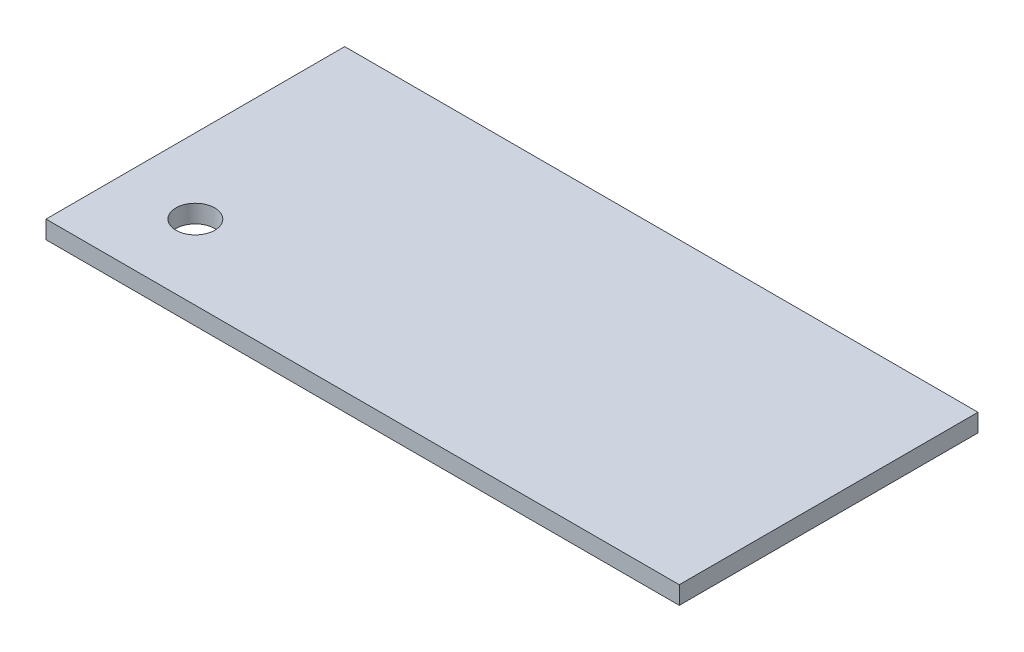
ISO-10303-21;
HEADER;
FILE_DESCRIPTION(('STEP AP214'),'2;1');
FILE_NAME('part.step','',(''),(''),'','','');
FILE_SCHEMA(('AUTOMOTIVE_DESIGN { 1 0 10303 214 1 1 1 1 }'));
ENDSEC;
DATA;
#1=APPLICATION_CONTEXT('core data for automotive mechanical design processes');
#2=APPLICATION_PROTOCOL_DEFINITION('international standard','automotive_design',2000,#1);
#3=PRODUCT_CONTEXT('',#1,'mechanical');
#4=PRODUCT('Part','Part','',(#3));
#5=PRODUCT_RELATED_PRODUCT_CATEGORY('part','',(#4));
#6=PRODUCT_DEFINITION_FORMATION('','',#4);
#7=PRODUCT_DEFINITION_CONTEXT('part definition',#1,'design');
#8=PRODUCT_DEFINITION('design','',#6,#7);
#9=PRODUCT_DEFINITION_SHAPE('','',#8);
#10=(LENGTH_UNIT() NAMED_UNIT(*) SI_UNIT(.MILLI.,.METRE.));
#11=(NAMED_UNIT(*) PLANE_ANGLE_UNIT() SI_UNIT($,.RADIAN.));
#12=(NAMED_UNIT(*) SI_UNIT($,.STERADIAN.) SOLID_ANGLE_UNIT());
#13=UNCERTAINTY_MEASURE_WITH_UNIT(LENGTH_MEASURE(1.E-05),#10,'distance_accuracy_value','');
#14=(GEOMETRIC_REPRESENTATION_CONTEXT(3) GLOBAL_UNCERTAINTY_ASSIGNED_CONTEXT((#13)) GLOBAL_UNIT_ASSIGNED_CONTEXT((#10,
#11,#12)) REPRESENTATION_CONTEXT('',''));
#15=CARTESIAN_POINT('',(0.,0.,0.));
#16=DIRECTION('',(0.,0.,1.));
#17=DIRECTION('',(1.,0.,0.));
#18=AXIS2_PLACEMENT_3D('',#15,#16,#17);
#19=CARTESIAN_POINT('',(0.,6.,0.));
#20=DIRECTION('',(1.,0.,0.));
#21=DIRECTION('',(0.,0.,-1.));
#22=AXIS2_PLACEMENT_3D('',#19,#20,#21);
#23=PLANE('',#22);
#24=DIRECTION('',(0.,0.,1.));
#25=VECTOR('',#24,1.);
#26=CARTESIAN_POINT('',(0.,0.,0.));
#27=LINE('',#26,#25);
#28=CARTESIAN_POINT('',(0.,0.,-100.));
#29=VERTEX_POINT('',#28);
#30=CARTESIAN_POINT('',(0.,0.,0.));
#31=VERTEX_POINT('',#30);
#32=EDGE_CURVE('E96',#29,#31,#27,.T.);
#33=ORIENTED_EDGE('',*,*,#32,.T.);
#34=DIRECTION('',(0.,-1.,0.));
#35=VECTOR('',#34,1.);
#36=CARTESIAN_POINT('',(0.,6.,0.));
#37=LINE('',#36,#35);
#38=CARTESIAN_POINT('',(0.,6.,0.));
#39=VERTEX_POINT('',#38);
#40=EDGE_CURVE('E11',#39,#31,#37,.T.);
#41=ORIENTED_EDGE('',*,*,#40,.F.);
#42=DIRECTION('',(0.,0.,1.));
#43=VECTOR('',#42,1.);
#44=CARTESIAN_POINT('',(0.,6.,0.));
#45=LINE('',#44,#43);
#46=CARTESIAN_POINT('',(0.,6.,-100.));
#47=VERTEX_POINT('',#46);
#48=EDGE_CURVE('E84',#47,#39,#45,.T.);
#49=ORIENTED_EDGE('',*,*,#48,.F.);
#50=DIRECTION('',(0.,-1.,0.));
#51=VECTOR('',#50,1.);
#52=CARTESIAN_POINT('',(0.,6.,-100.));
#53=LINE('',#52,#51);
#54=EDGE_CURVE('E92',#47,#29,#53,.T.);
#55=ORIENTED_EDGE('',*,*,#54,.T.);
#56=EDGE_LOOP('',(#33,#41,#49,#55));
#57=FACE_BOUND('',#56,.T.);
#58=ADVANCED_FACE('F33',(#57),#23,.F.);
#59=CARTESIAN_POINT('',(0.,6.,0.));
#60=DIRECTION('',(0.,0.,-1.));
#61=DIRECTION('',(-1.,0.,0.));
#62=AXIS2_PLACEMENT_3D('',#59,#60,#61);
#63=PLANE('',#62);
#64=DIRECTION('',(1.,0.,0.));
#65=VECTOR('',#64,1.);
#66=CARTESIAN_POINT('',(0.,0.,0.));
#67=LINE('',#66,#65);
#68=CARTESIAN_POINT('',(212.,0.,0.));
#69=VERTEX_POINT('',#68);
#70=EDGE_CURVE('E88',#31,#69,#67,.T.);
#71=ORIENTED_EDGE('',*,*,#70,.T.);
#72=DIRECTION('',(0.,-1.,0.));
#73=VECTOR('',#72,1.);
#74=CARTESIAN_POINT('',(212.,6.,0.));
#75=LINE('',#74,#73);
#76=CARTESIAN_POINT('',(212.,6.,0.));
#77=VERTEX_POINT('',#76);
#78=EDGE_CURVE('E41',#77,#69,#75,.T.);
#79=ORIENTED_EDGE('',*,*,#78,.F.);
#80=DIRECTION('',(1.,0.,0.));
#81=VECTOR('',#80,1.);
#82=CARTESIAN_POINT('',(0.,6.,0.));
#83=LINE('',#82,#81);
#84=EDGE_CURVE('E79',#39,#77,#83,.T.);
#85=ORIENTED_EDGE('',*,*,#84,.F.);
#86=ORIENTED_EDGE('',*,*,#40,.T.);
#87=EDGE_LOOP('',(#71,#79,#85,#86));
#88=FACE_BOUND('',#87,.T.);
#89=ADVANCED_FACE('F87',(#88),#63,.F.);
#90=CARTESIAN_POINT('',(212.,6.,0.));
#91=DIRECTION('',(-1.,0.,0.));
#92=DIRECTION('',(0.,0.,1.));
#93=AXIS2_PLACEMENT_3D('',#90,#91,#92);
#94=PLANE('',#93);
#95=DIRECTION('',(0.,0.,-1.));
#96=VECTOR('',#95,1.);
#97=CARTESIAN_POINT('',(212.,0.,0.));
#98=LINE('',#97,#96);
#99=CARTESIAN_POINT('',(212.,0.,-100.));
#100=VERTEX_POINT('',#99);
#101=EDGE_CURVE('E66',#69,#100,#98,.T.);
#102=ORIENTED_EDGE('',*,*,#101,.T.);
#103=DIRECTION('',(0.,-1.,0.));
#104=VECTOR('',#103,1.);
#105=CARTESIAN_POINT('',(212.,6.,-100.));
#106=LINE('',#105,#104);
#107=CARTESIAN_POINT('',(212.,6.,-100.));
#108=VERTEX_POINT('',#107);
#109=EDGE_CURVE('E89',#108,#100,#106,.T.);
#110=ORIENTED_EDGE('',*,*,#109,.F.);
#111=DIRECTION('',(0.,0.,-1.));
#112=VECTOR('',#111,1.);
#113=CARTESIAN_POINT('',(212.,6.,0.));
#114=LINE('',#113,#112);
#115=EDGE_CURVE('E82',#77,#108,#114,.T.);
#116=ORIENTED_EDGE('',*,*,#115,.F.);
#117=ORIENTED_EDGE('',*,*,#78,.T.);
#118=EDGE_LOOP('',(#102,#110,#116,#117));
#119=FACE_BOUND('',#118,.T.);
#120=ADVANCED_FACE('F90',(#119),#94,.F.);
#121=CARTESIAN_POINT('',(0.,6.,-100.));
#122=DIRECTION('',(0.,0.,1.));
#123=DIRECTION('',(1.,0.,0.));
#124=AXIS2_PLACEMENT_3D('',#121,#122,#123);
#125=PLANE('',#124);
#126=DIRECTION('',(-1.,0.,0.));
#127=VECTOR('',#126,1.);
#128=CARTESIAN_POINT('',(0.,0.,-100.));
#129=LINE('',#128,#127);
#130=EDGE_CURVE('E72',#100,#29,#129,.T.);
#131=ORIENTED_EDGE('',*,*,#130,.T.);
#132=ORIENTED_EDGE('',*,*,#54,.F.);
#133=DIRECTION('',(-1.,0.,0.));
#134=VECTOR('',#133,1.);
#135=CARTESIAN_POINT('',(0.,6.,-100.));
#136=LINE('',#135,#134);
#137=EDGE_CURVE('E49',#108,#47,#136,.T.);
#138=ORIENTED_EDGE('',*,*,#137,.F.);
#139=ORIENTED_EDGE('',*,*,#109,.T.);
#140=EDGE_LOOP('',(#131,#132,#138,#139));
#141=FACE_BOUND('',#140,.T.);
#142=ADVANCED_FACE('F104',(#141),#125,.F.);
#143=CARTESIAN_POINT('',(0.,6.,0.));
#144=DIRECTION('',(0.,-1.,0.));
#145=DIRECTION('',(0.,0.,-1.));
#146=AXIS2_PLACEMENT_3D('',#143,#144,#145);
#147=PLANE('',#146);
#148=CARTESIAN_POINT('',(25.,6.,-25.));
#149=DIRECTION('',(0.,1.,0.));
#150=DIRECTION('',(0.,0.,1.));
#151=AXIS2_PLACEMENT_3D('',#148,#149,#150);
#152=CIRCLE('',#151,6.5);
#153=CARTESIAN_POINT('',(25.,6.,-18.5));
#154=VERTEX_POINT('',#153);
#155=EDGE_CURVE('E110',#154,#154,#152,.T.);
#156=ORIENTED_EDGE('',*,*,#155,.F.);
#157=EDGE_LOOP('',(#156));
#158=FACE_BOUND('',#157,.T.);
#159=ORIENTED_EDGE('',*,*,#48,.T.);
#160=ORIENTED_EDGE('',*,*,#84,.T.);
#161=ORIENTED_EDGE('',*,*,#115,.T.);
#162=ORIENTED_EDGE('',*,*,#137,.T.);
#163=EDGE_LOOP('',(#159,#160,#161,#162));
#164=FACE_BOUND('',#163,.T.);
#165=ADVANCED_FACE('F80',(#158,#164),#147,.F.);
#166=CARTESIAN_POINT('',(0.,0.,0.));
#167=DIRECTION('',(0.,-1.,0.));
#168=DIRECTION('',(0.,0.,-1.));
#169=AXIS2_PLACEMENT_3D('',#166,#167,#168);
#170=PLANE('',#169);
#171=CARTESIAN_POINT('',(25.,0.,-25.));
#172=DIRECTION('',(0.,1.,0.));
#173=DIRECTION('',(0.,0.,1.));
#174=AXIS2_PLACEMENT_3D('',#171,#172,#173);
#175=CIRCLE('',#174,6.5);
#176=CARTESIAN_POINT('',(25.,0.,-18.5));
#177=VERTEX_POINT('',#176);
#178=EDGE_CURVE('E99',#177,#177,#175,.T.);
#179=ORIENTED_EDGE('',*,*,#178,.T.);
#180=EDGE_LOOP('',(#179));
#181=FACE_BOUND('',#180,.T.);
#182=ORIENTED_EDGE('',*,*,#32,.F.);
#183=ORIENTED_EDGE('',*,*,#130,.F.);
#184=ORIENTED_EDGE('',*,*,#101,.F.);
#185=ORIENTED_EDGE('',*,*,#70,.F.);
#186=EDGE_LOOP('',(#182,#183,#184,#185));
#187=FACE_BOUND('',#186,.T.);
#188=ADVANCED_FACE('F107',(#181,#187),#170,.T.);
#189=CARTESIAN_POINT('',(25.,0.,-25.));
#190=DIRECTION('',(0.,1.,0.));
#191=DIRECTION('',(0.,0.,1.));
#192=AXIS2_PLACEMENT_3D('',#189,#190,#191);
#193=CYLINDRICAL_SURFACE('',#192,6.5);
#194=ORIENTED_EDGE('',*,*,#178,.F.);
#195=EDGE_LOOP('',(#194));
#196=FACE_BOUND('',#195,.T.);
#197=ORIENTED_EDGE('',*,*,#155,.T.);
#198=EDGE_LOOP('',(#197));
#199=FACE_BOUND('',#198,.T.);
#200=ADVANCED_FACE('F117',(#196,#199),#193,.F.);
#201=CLOSED_SHELL('',(#58,#89,#120,#142,#165,#188,#200));
#202=MANIFOLD_SOLID_BREP('B2',#201);
#203=ADVANCED_BREP_SHAPE_REPRESENTATION('',(#18,#202),#14);
#204=SHAPE_DEFINITION_REPRESENTATION(#9,#203);
ENDSEC;
END-ISO-10303-21;
